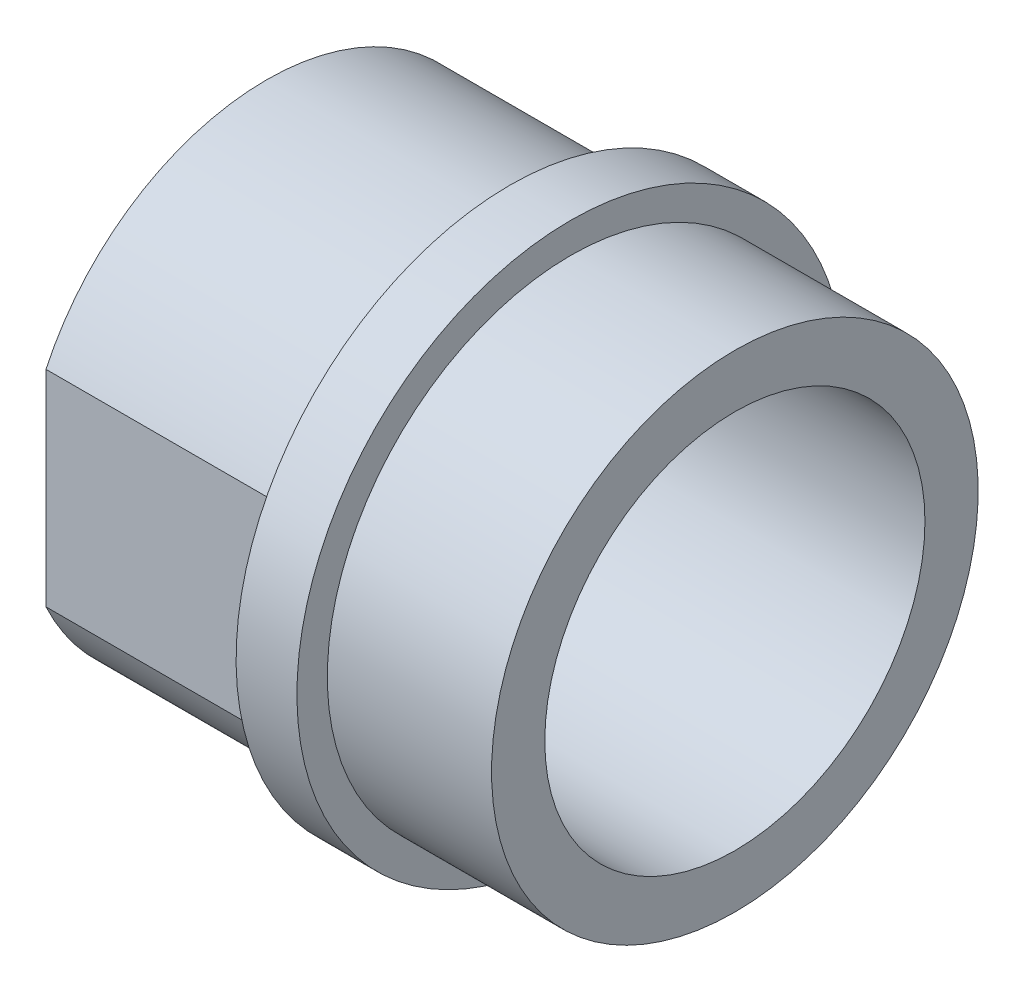
ISO-10303-21;
HEADER;
FILE_DESCRIPTION(('STEP AP214'),'2;1');
FILE_NAME('part.step','',(''),(''),'','','');
FILE_SCHEMA(('AUTOMOTIVE_DESIGN { 1 0 10303 214 1 1 1 1 }'));
ENDSEC;
DATA;
#1=APPLICATION_CONTEXT('core data for automotive mechanical design processes');
#2=APPLICATION_PROTOCOL_DEFINITION('international standard','automotive_design',2000,#1);
#3=PRODUCT_CONTEXT('',#1,'mechanical');
#4=PRODUCT('Part','Part','',(#3));
#5=PRODUCT_RELATED_PRODUCT_CATEGORY('part','',(#4));
#6=PRODUCT_DEFINITION_FORMATION('','',#4);
#7=PRODUCT_DEFINITION_CONTEXT('part definition',#1,'design');
#8=PRODUCT_DEFINITION('design','',#6,#7);
#9=PRODUCT_DEFINITION_SHAPE('','',#8);
#10=(LENGTH_UNIT() NAMED_UNIT(*) SI_UNIT(.MILLI.,.METRE.));
#11=(NAMED_UNIT(*) PLANE_ANGLE_UNIT() SI_UNIT($,.RADIAN.));
#12=(NAMED_UNIT(*) SI_UNIT($,.STERADIAN.) SOLID_ANGLE_UNIT());
#13=UNCERTAINTY_MEASURE_WITH_UNIT(LENGTH_MEASURE(1.E-05),#10,'distance_accuracy_value','');
#14=(GEOMETRIC_REPRESENTATION_CONTEXT(3) GLOBAL_UNCERTAINTY_ASSIGNED_CONTEXT((#13)) GLOBAL_UNIT_ASSIGNED_CONTEXT((#10,
#11,#12)) REPRESENTATION_CONTEXT('',''));
#15=CARTESIAN_POINT('',(0.,0.,0.));
#16=DIRECTION('',(0.,0.,1.));
#17=DIRECTION('',(1.,0.,0.));
#18=AXIS2_PLACEMENT_3D('',#15,#16,#17);
#19=CARTESIAN_POINT('',(15.4,0.,0.));
#20=DIRECTION('',(1.,0.,0.));
#21=DIRECTION('',(0.,1.,0.));
#22=AXIS2_PLACEMENT_3D('',#19,#20,#21);
#23=CYLINDRICAL_SURFACE('',#22,8.);
#24=DIRECTION('',(1.,0.,0.));
#25=VECTOR('',#24,1.);
#26=CARTESIAN_POINT('',(15.4,3.38193731461717,7.25));
#27=LINE('',#26,#25);
#28=CARTESIAN_POINT('',(8.,3.38193731461717,7.25));
#29=VERTEX_POINT('',#28);
#30=CARTESIAN_POINT('',(0.,3.38193731461717,7.25));
#31=VERTEX_POINT('',#30);
#32=EDGE_CURVE('E75',#29,#31,#27,.F.);
#33=ORIENTED_EDGE('',*,*,#32,.F.);
#34=CARTESIAN_POINT('',(8.,0.,0.));
#35=DIRECTION('',(1.,0.,0.));
#36=DIRECTION('',(0.,1.,0.));
#37=AXIS2_PLACEMENT_3D('',#34,#35,#36);
#38=CIRCLE('',#37,8.);
#39=CARTESIAN_POINT('',(8.,3.38193731461717,-7.25));
#40=VERTEX_POINT('',#39);
#41=EDGE_CURVE('E85',#40,#29,#38,.T.);
#42=ORIENTED_EDGE('',*,*,#41,.F.);
#43=DIRECTION('',(1.,0.,0.));
#44=VECTOR('',#43,1.);
#45=CARTESIAN_POINT('',(15.4,3.38193731461717,-7.25));
#46=LINE('',#45,#44);
#47=CARTESIAN_POINT('',(0.,3.38193731461717,-7.25));
#48=VERTEX_POINT('',#47);
#49=EDGE_CURVE('E114',#48,#40,#46,.T.);
#50=ORIENTED_EDGE('',*,*,#49,.F.);
#51=CARTESIAN_POINT('',(0.,0.,0.));
#52=DIRECTION('',(1.,0.,0.));
#53=DIRECTION('',(0.,1.,0.));
#54=AXIS2_PLACEMENT_3D('',#51,#52,#53);
#55=CIRCLE('',#54,8.);
#56=EDGE_CURVE('E11',#48,#31,#55,.T.);
#57=ORIENTED_EDGE('',*,*,#56,.T.);
#58=EDGE_LOOP('',(#33,#42,#50,#57));
#59=FACE_BOUND('',#58,.T.);
#60=ADVANCED_FACE('F35',(#59),#23,.T.);
#61=CARTESIAN_POINT('',(15.4,8.,0.));
#62=DIRECTION('',(1.,0.,0.));
#63=DIRECTION('',(0.,1.,0.));
#64=AXIS2_PLACEMENT_3D('',#61,#62,#63);
#65=PLANE('',#64);
#66=CARTESIAN_POINT('',(15.4,0.,0.));
#67=DIRECTION('',(1.,0.,0.));
#68=DIRECTION('',(0.,1.,0.));
#69=AXIS2_PLACEMENT_3D('',#66,#67,#68);
#70=CIRCLE('',#69,8.);
#71=CARTESIAN_POINT('',(15.4,8.,0.));
#72=VERTEX_POINT('',#71);
#73=EDGE_CURVE('E102',#72,#72,#70,.T.);
#74=ORIENTED_EDGE('',*,*,#73,.T.);
#75=EDGE_LOOP('',(#74));
#76=FACE_BOUND('',#75,.T.);
#77=CARTESIAN_POINT('',(15.4,0.,0.));
#78=DIRECTION('',(-1.,0.,0.));
#79=DIRECTION('',(0.,-1.,0.));
#80=AXIS2_PLACEMENT_3D('',#77,#78,#79);
#81=CIRCLE('',#80,6.25);
#82=CARTESIAN_POINT('',(15.4,-6.25,0.));
#83=VERTEX_POINT('',#82);
#84=EDGE_CURVE('E106',#83,#83,#81,.T.);
#85=ORIENTED_EDGE('',*,*,#84,.T.);
#86=EDGE_LOOP('',(#85));
#87=FACE_BOUND('',#86,.T.);
#88=ADVANCED_FACE('F140',(#76,#87),#65,.T.);
#89=CARTESIAN_POINT('',(0.,0.,0.));
#90=DIRECTION('',(-1.,0.,0.));
#91=DIRECTION('',(0.,-1.,0.));
#92=AXIS2_PLACEMENT_3D('',#89,#90,#91);
#93=PLANE('',#92);
#94=DIRECTION('',(0.,-1.,0.));
#95=VECTOR('',#94,1.);
#96=CARTESIAN_POINT('',(0.,9.42450546026589,7.25));
#97=LINE('',#96,#95);
#98=CARTESIAN_POINT('',(0.,-3.38193731461717,7.25));
#99=VERTEX_POINT('',#98);
#100=EDGE_CURVE('E80',#31,#99,#97,.T.);
#101=ORIENTED_EDGE('',*,*,#100,.F.);
#102=ORIENTED_EDGE('',*,*,#56,.F.);
#103=DIRECTION('',(0.,1.,0.));
#104=VECTOR('',#103,1.);
#105=CARTESIAN_POINT('',(0.,9.42450546026588,-7.25));
#106=LINE('',#105,#104);
#107=CARTESIAN_POINT('',(0.,-3.38193731461717,-7.25));
#108=VERTEX_POINT('',#107);
#109=EDGE_CURVE('E87',#108,#48,#106,.T.);
#110=ORIENTED_EDGE('',*,*,#109,.F.);
#111=EDGE_CURVE('E43',#99,#108,#55,.T.);
#112=ORIENTED_EDGE('',*,*,#111,.F.);
#113=EDGE_LOOP('',(#101,#102,#110,#112));
#114=FACE_BOUND('',#113,.T.);
#115=ADVANCED_FACE('F37',(#114),#93,.T.);
#116=DIRECTION('',(1.,0.,0.));
#117=VECTOR('',#116,1.);
#118=CARTESIAN_POINT('',(15.4,-3.38193731461717,7.25));
#119=LINE('',#118,#117);
#120=CARTESIAN_POINT('',(8.,-3.38193731461717,7.25));
#121=VERTEX_POINT('',#120);
#122=EDGE_CURVE('E78',#99,#121,#119,.T.);
#123=ORIENTED_EDGE('',*,*,#122,.F.);
#124=ORIENTED_EDGE('',*,*,#111,.T.);
#125=DIRECTION('',(1.,0.,0.));
#126=VECTOR('',#125,1.);
#127=CARTESIAN_POINT('',(15.4,-3.38193731461717,-7.25));
#128=LINE('',#127,#126);
#129=CARTESIAN_POINT('',(8.,-3.38193731461717,-7.25));
#130=VERTEX_POINT('',#129);
#131=EDGE_CURVE('E109',#130,#108,#128,.F.);
#132=ORIENTED_EDGE('',*,*,#131,.F.);
#133=EDGE_CURVE('E91',#121,#130,#38,.T.);
#134=ORIENTED_EDGE('',*,*,#133,.F.);
#135=EDGE_LOOP('',(#123,#124,#132,#134));
#136=FACE_BOUND('',#135,.T.);
#137=ADVANCED_FACE('F122',(#136),#23,.T.);
#138=CARTESIAN_POINT('',(8.,8.,0.));
#139=DIRECTION('',(-1.,0.,0.));
#140=DIRECTION('',(0.,-1.,0.));
#141=AXIS2_PLACEMENT_3D('',#138,#139,#140);
#142=PLANE('',#141);
#143=ORIENTED_EDGE('',*,*,#41,.T.);
#144=DIRECTION('',(0.,1.,0.));
#145=VECTOR('',#144,1.);
#146=CARTESIAN_POINT('',(8.,9.42450546026589,7.25));
#147=LINE('',#146,#145);
#148=EDGE_CURVE('E50',#121,#29,#147,.T.);
#149=ORIENTED_EDGE('',*,*,#148,.F.);
#150=ORIENTED_EDGE('',*,*,#133,.T.);
#151=DIRECTION('',(0.,-1.,0.));
#152=VECTOR('',#151,1.);
#153=CARTESIAN_POINT('',(8.,9.42450546026588,-7.25));
#154=LINE('',#153,#152);
#155=EDGE_CURVE('E55',#40,#130,#154,.T.);
#156=ORIENTED_EDGE('',*,*,#155,.F.);
#157=EDGE_LOOP('',(#143,#149,#150,#156));
#158=FACE_BOUND('',#157,.T.);
#159=CARTESIAN_POINT('',(8.,0.,0.));
#160=DIRECTION('',(1.,0.,0.));
#161=DIRECTION('',(0.,1.,0.));
#162=AXIS2_PLACEMENT_3D('',#159,#160,#161);
#163=CIRCLE('',#162,9.);
#164=CARTESIAN_POINT('',(8.,9.,0.));
#165=VERTEX_POINT('',#164);
#166=EDGE_CURVE('E92',#165,#165,#163,.T.);
#167=ORIENTED_EDGE('',*,*,#166,.F.);
#168=EDGE_LOOP('',(#167));
#169=FACE_BOUND('',#168,.T.);
#170=ADVANCED_FACE('F89',(#158,#169),#142,.T.);
#171=CARTESIAN_POINT('',(15.4,0.,0.));
#172=DIRECTION('',(1.,0.,0.));
#173=DIRECTION('',(0.,1.,0.));
#174=AXIS2_PLACEMENT_3D('',#171,#172,#173);
#175=CYLINDRICAL_SURFACE('',#174,9.);
#176=ORIENTED_EDGE('',*,*,#166,.T.);
#177=EDGE_LOOP('',(#176));
#178=FACE_BOUND('',#177,.T.);
#179=CARTESIAN_POINT('',(10.,0.,0.));
#180=DIRECTION('',(1.,0.,0.));
#181=DIRECTION('',(0.,1.,0.));
#182=AXIS2_PLACEMENT_3D('',#179,#180,#181);
#183=CIRCLE('',#182,9.);
#184=CARTESIAN_POINT('',(10.,9.,0.));
#185=VERTEX_POINT('',#184);
#186=EDGE_CURVE('E96',#185,#185,#183,.T.);
#187=ORIENTED_EDGE('',*,*,#186,.F.);
#188=EDGE_LOOP('',(#187));
#189=FACE_BOUND('',#188,.T.);
#190=ADVANCED_FACE('F153',(#178,#189),#175,.T.);
#191=CARTESIAN_POINT('',(10.,9.,0.));
#192=DIRECTION('',(1.,0.,0.));
#193=DIRECTION('',(0.,1.,0.));
#194=AXIS2_PLACEMENT_3D('',#191,#192,#193);
#195=PLANE('',#194);
#196=ORIENTED_EDGE('',*,*,#186,.T.);
#197=EDGE_LOOP('',(#196));
#198=FACE_BOUND('',#197,.T.);
#199=CARTESIAN_POINT('',(10.,0.,0.));
#200=DIRECTION('',(1.,0.,0.));
#201=DIRECTION('',(0.,1.,0.));
#202=AXIS2_PLACEMENT_3D('',#199,#200,#201);
#203=CIRCLE('',#202,8.);
#204=CARTESIAN_POINT('',(10.,8.,0.));
#205=VERTEX_POINT('',#204);
#206=EDGE_CURVE('E99',#205,#205,#203,.T.);
#207=ORIENTED_EDGE('',*,*,#206,.F.);
#208=EDGE_LOOP('',(#207));
#209=FACE_BOUND('',#208,.T.);
#210=ADVANCED_FACE('F170',(#198,#209),#195,.T.);
#211=CARTESIAN_POINT('',(15.4,0.,0.));
#212=DIRECTION('',(1.,0.,0.));
#213=DIRECTION('',(0.,1.,0.));
#214=AXIS2_PLACEMENT_3D('',#211,#212,#213);
#215=CYLINDRICAL_SURFACE('',#214,8.);
#216=ORIENTED_EDGE('',*,*,#206,.T.);
#217=EDGE_LOOP('',(#216));
#218=FACE_BOUND('',#217,.T.);
#219=ORIENTED_EDGE('',*,*,#73,.F.);
#220=EDGE_LOOP('',(#219));
#221=FACE_BOUND('',#220,.T.);
#222=ADVANCED_FACE('F180',(#218,#221),#215,.T.);
#223=CARTESIAN_POINT('',(5.4,0.,0.));
#224=DIRECTION('',(1.,0.,0.));
#225=DIRECTION('',(0.,1.,0.));
#226=AXIS2_PLACEMENT_3D('',#223,#224,#225);
#227=CYLINDRICAL_SURFACE('',#226,6.25);
#228=CARTESIAN_POINT('',(5.4,0.,0.));
#229=DIRECTION('',(-1.,0.,0.));
#230=DIRECTION('',(0.,-1.,0.));
#231=AXIS2_PLACEMENT_3D('',#228,#229,#230);
#232=CIRCLE('',#231,6.25);
#233=CARTESIAN_POINT('',(5.4,-6.25,0.));
#234=VERTEX_POINT('',#233);
#235=EDGE_CURVE('E105',#234,#234,#232,.T.);
#236=ORIENTED_EDGE('',*,*,#235,.T.);
#237=EDGE_LOOP('',(#236));
#238=FACE_BOUND('',#237,.T.);
#239=ORIENTED_EDGE('',*,*,#84,.F.);
#240=EDGE_LOOP('',(#239));
#241=FACE_BOUND('',#240,.T.);
#242=ADVANCED_FACE('F136',(#238,#241),#227,.F.);
#243=CARTESIAN_POINT('',(5.4,0.,0.));
#244=DIRECTION('',(-1.,0.,0.));
#245=DIRECTION('',(0.,-1.,0.));
#246=AXIS2_PLACEMENT_3D('',#243,#244,#245);
#247=PLANE('',#246);
#248=ORIENTED_EDGE('',*,*,#235,.F.);
#249=EDGE_LOOP('',(#248));
#250=FACE_BOUND('',#249,.T.);
#251=ADVANCED_FACE('F128',(#250),#247,.F.);
#252=CARTESIAN_POINT('',(28.4633709975862,9.42450546026588,-7.25));
#253=DIRECTION('',(0.,0.,1.));
#254=DIRECTION('',(0.,-1.,0.));
#255=AXIS2_PLACEMENT_3D('',#252,#253,#254);
#256=PLANE('',#255);
#257=ORIENTED_EDGE('',*,*,#131,.T.);
#258=ORIENTED_EDGE('',*,*,#109,.T.);
#259=ORIENTED_EDGE('',*,*,#49,.T.);
#260=ORIENTED_EDGE('',*,*,#155,.T.);
#261=EDGE_LOOP('',(#257,#258,#259,#260));
#262=FACE_BOUND('',#261,.T.);
#263=ADVANCED_FACE('F126',(#262),#256,.F.);
#264=CARTESIAN_POINT('',(28.4633709975862,9.42450546026588,7.25));
#265=DIRECTION('',(0.,0.,-1.));
#266=DIRECTION('',(0.,1.,0.));
#267=AXIS2_PLACEMENT_3D('',#264,#265,#266);
#268=PLANE('',#267);
#269=ORIENTED_EDGE('',*,*,#32,.T.);
#270=ORIENTED_EDGE('',*,*,#100,.T.);
#271=ORIENTED_EDGE('',*,*,#122,.T.);
#272=ORIENTED_EDGE('',*,*,#148,.T.);
#273=EDGE_LOOP('',(#269,#270,#271,#272));
#274=FACE_BOUND('',#273,.T.);
#275=ADVANCED_FACE('F74',(#274),#268,.F.);
#276=CLOSED_SHELL('',(#60,#88,#115,#137,#170,#190,#210,#222,#242,#251,#263,#275));
#277=MANIFOLD_SOLID_BREP('B2',#276);
#278=ADVANCED_BREP_SHAPE_REPRESENTATION('',(#18,#277),#14);
#279=SHAPE_DEFINITION_REPRESENTATION(#9,#278);
ENDSEC;
END-ISO-10303-21;
